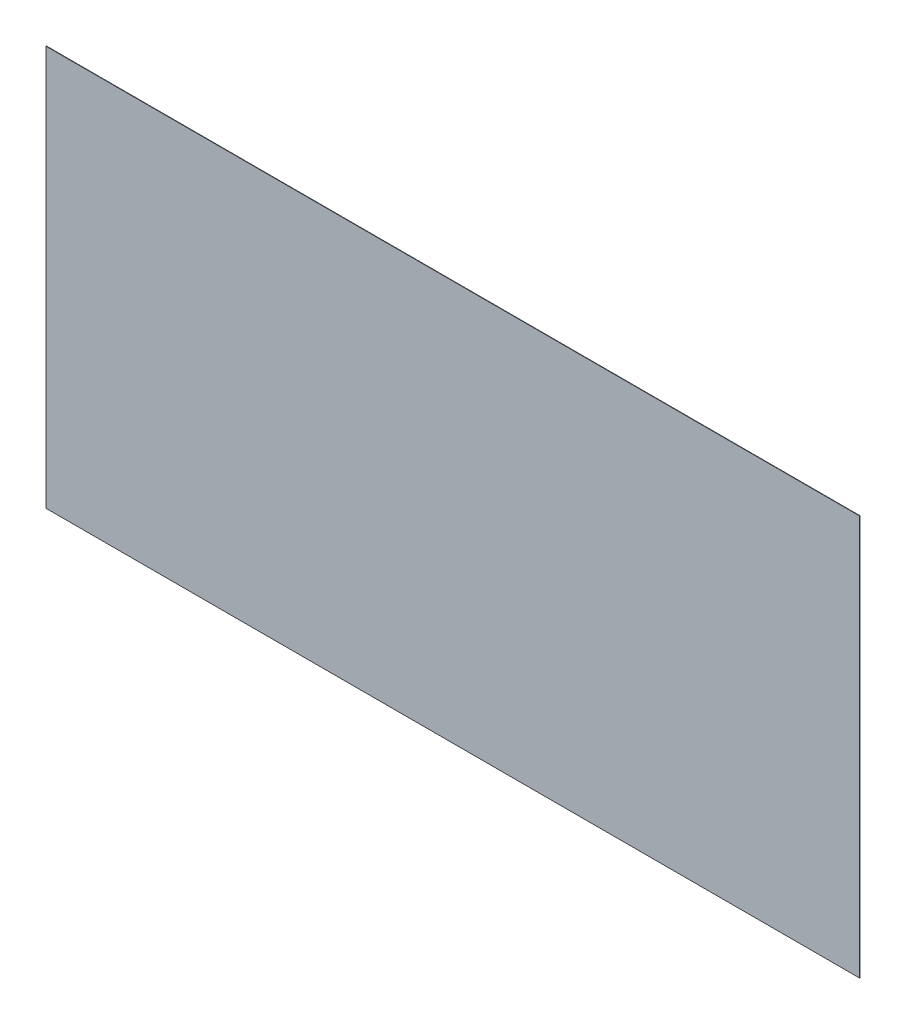
ISO-10303-21;
HEADER;
FILE_DESCRIPTION(('STEP AP214'),'2;1');
FILE_NAME('part.step','',(''),(''),'','','');
FILE_SCHEMA(('AUTOMOTIVE_DESIGN { 1 0 10303 214 1 1 1 1 }'));
ENDSEC;
DATA;
#1=APPLICATION_CONTEXT('core data for automotive mechanical design processes');
#2=APPLICATION_PROTOCOL_DEFINITION('international standard','automotive_design',2000,#1);
#3=PRODUCT_CONTEXT('',#1,'mechanical');
#4=PRODUCT('Part','Part','',(#3));
#5=PRODUCT_RELATED_PRODUCT_CATEGORY('part','',(#4));
#6=PRODUCT_DEFINITION_FORMATION('','',#4);
#7=PRODUCT_DEFINITION_CONTEXT('part definition',#1,'design');
#8=PRODUCT_DEFINITION('design','',#6,#7);
#9=PRODUCT_DEFINITION_SHAPE('','',#8);
#10=(LENGTH_UNIT() NAMED_UNIT(*) SI_UNIT(.MILLI.,.METRE.));
#11=(NAMED_UNIT(*) PLANE_ANGLE_UNIT() SI_UNIT($,.RADIAN.));
#12=(NAMED_UNIT(*) SI_UNIT($,.STERADIAN.) SOLID_ANGLE_UNIT());
#13=UNCERTAINTY_MEASURE_WITH_UNIT(LENGTH_MEASURE(1.E-05),#10,'distance_accuracy_value','');
#14=(GEOMETRIC_REPRESENTATION_CONTEXT(3) GLOBAL_UNCERTAINTY_ASSIGNED_CONTEXT((#13)) GLOBAL_UNIT_ASSIGNED_CONTEXT((#10,
#11,#12)) REPRESENTATION_CONTEXT('',''));
#15=CARTESIAN_POINT('',(0.,0.,0.));
#16=DIRECTION('',(0.,0.,1.));
#17=DIRECTION('',(1.,0.,0.));
#18=AXIS2_PLACEMENT_3D('',#15,#16,#17);
#19=CARTESIAN_POINT('',(-400000.,-60.0000000000023,151.327));
#20=DIRECTION('',(0.,-1.,0.));
#21=DIRECTION('',(0.,0.,-1.));
#22=AXIS2_PLACEMENT_3D('',#19,#20,#21);
#23=PLANE('',#22);
#24=DIRECTION('',(-1.,0.,0.));
#25=VECTOR('',#24,1.);
#26=CARTESIAN_POINT('',(-400000.,-60.0000000000023,151.2));
#27=LINE('',#26,#25);
#28=CARTESIAN_POINT('',(125.000000000024,-60.0000000000023,151.2));
#29=VERTEX_POINT('',#28);
#30=CARTESIAN_POINT('',(-125.000000000009,-60.0000000000023,151.2));
#31=VERTEX_POINT('',#30);
#32=EDGE_CURVE('E117',#29,#31,#27,.T.);
#33=ORIENTED_EDGE('',*,*,#32,.F.);
#34=DIRECTION('',(0.,0.,-1.));
#35=VECTOR('',#34,1.);
#36=CARTESIAN_POINT('',(125.000000000024,-60.0000000000023,151.327));
#37=LINE('',#36,#35);
#38=CARTESIAN_POINT('',(125.000000000024,-60.0000000000023,151.327));
#39=VERTEX_POINT('',#38);
#40=EDGE_CURVE('E11',#39,#29,#37,.T.);
#41=ORIENTED_EDGE('',*,*,#40,.F.);
#42=DIRECTION('',(-1.,0.,0.));
#43=VECTOR('',#42,1.);
#44=CARTESIAN_POINT('',(-400000.,-60.0000000000023,151.327));
#45=LINE('',#44,#43);
#46=CARTESIAN_POINT('',(-125.000000000009,-60.0000000000023,151.327));
#47=VERTEX_POINT('',#46);
#48=EDGE_CURVE('E109',#39,#47,#45,.T.);
#49=ORIENTED_EDGE('',*,*,#48,.T.);
#50=DIRECTION('',(0.,0.,-1.));
#51=VECTOR('',#50,1.);
#52=CARTESIAN_POINT('',(-125.000000000009,-60.0000000000023,151.327));
#53=LINE('',#52,#51);
#54=EDGE_CURVE('E50',#47,#31,#53,.T.);
#55=ORIENTED_EDGE('',*,*,#54,.T.);
#56=EDGE_LOOP('',(#33,#41,#49,#55));
#57=FACE_BOUND('',#56,.T.);
#58=ADVANCED_FACE('F47',(#57),#23,.T.);
#59=CARTESIAN_POINT('',(125.000000000057,-291534.,151.327));
#60=DIRECTION('',(1.,0.,0.));
#61=DIRECTION('',(0.,1.,0.));
#62=AXIS2_PLACEMENT_3D('',#59,#60,#61);
#63=PLANE('',#62);
#64=DIRECTION('',(0.,-1.,0.));
#65=VECTOR('',#64,1.);
#66=CARTESIAN_POINT('',(125.000000000057,-291534.,151.2));
#67=LINE('',#66,#65);
#68=CARTESIAN_POINT('',(125.000000000024,62.9999999999882,151.2));
#69=VERTEX_POINT('',#68);
#70=EDGE_CURVE('E112',#69,#29,#67,.T.);
#71=ORIENTED_EDGE('',*,*,#70,.F.);
#72=DIRECTION('',(0.,0.,-1.));
#73=VECTOR('',#72,1.);
#74=CARTESIAN_POINT('',(125.000000000024,62.9999999999882,151.327));
#75=LINE('',#74,#73);
#76=CARTESIAN_POINT('',(125.000000000024,62.9999999999882,151.327));
#77=VERTEX_POINT('',#76);
#78=EDGE_CURVE('E57',#77,#69,#75,.T.);
#79=ORIENTED_EDGE('',*,*,#78,.F.);
#80=DIRECTION('',(0.,-1.,0.));
#81=VECTOR('',#80,1.);
#82=CARTESIAN_POINT('',(125.000000000057,-291534.,151.327));
#83=LINE('',#82,#81);
#84=EDGE_CURVE('E104',#77,#39,#83,.T.);
#85=ORIENTED_EDGE('',*,*,#84,.T.);
#86=ORIENTED_EDGE('',*,*,#40,.T.);
#87=EDGE_LOOP('',(#71,#79,#85,#86));
#88=FACE_BOUND('',#87,.T.);
#89=ADVANCED_FACE('F133',(#88),#63,.T.);
#90=CARTESIAN_POINT('',(-400000.,62.9999999999882,151.327));
#91=DIRECTION('',(0.,1.,0.));
#92=DIRECTION('',(0.,0.,1.));
#93=AXIS2_PLACEMENT_3D('',#90,#91,#92);
#94=PLANE('',#93);
#95=DIRECTION('',(1.,0.,0.));
#96=VECTOR('',#95,1.);
#97=CARTESIAN_POINT('',(-400000.,62.9999999999882,151.2));
#98=LINE('',#97,#96);
#99=CARTESIAN_POINT('',(-125.,62.9999999999882,151.2));
#100=VERTEX_POINT('',#99);
#101=EDGE_CURVE('E98',#100,#69,#98,.T.);
#102=ORIENTED_EDGE('',*,*,#101,.F.);
#103=DIRECTION('',(0.,0.,-1.));
#104=VECTOR('',#103,1.);
#105=CARTESIAN_POINT('',(-125.,62.9999999999882,151.327));
#106=LINE('',#105,#104);
#107=CARTESIAN_POINT('',(-125.,62.9999999999882,151.327));
#108=VERTEX_POINT('',#107);
#109=EDGE_CURVE('E93',#108,#100,#106,.T.);
#110=ORIENTED_EDGE('',*,*,#109,.F.);
#111=DIRECTION('',(1.,0.,0.));
#112=VECTOR('',#111,1.);
#113=CARTESIAN_POINT('',(-400000.,62.9999999999882,151.327));
#114=LINE('',#113,#112);
#115=EDGE_CURVE('E96',#108,#77,#114,.T.);
#116=ORIENTED_EDGE('',*,*,#115,.T.);
#117=ORIENTED_EDGE('',*,*,#78,.T.);
#118=EDGE_LOOP('',(#102,#110,#116,#117));
#119=FACE_BOUND('',#118,.T.);
#120=ADVANCED_FACE('F95',(#119),#94,.T.);
#121=CARTESIAN_POINT('',(-124.999999999943,-291534.,151.327));
#122=DIRECTION('',(-1.,0.,0.));
#123=DIRECTION('',(0.,-1.,0.));
#124=AXIS2_PLACEMENT_3D('',#121,#122,#123);
#125=PLANE('',#124);
#126=DIRECTION('',(0.,1.,0.));
#127=VECTOR('',#126,1.);
#128=CARTESIAN_POINT('',(-124.999999999943,-291534.,151.2));
#129=LINE('',#128,#127);
#130=EDGE_CURVE('E121',#31,#100,#129,.T.);
#131=ORIENTED_EDGE('',*,*,#130,.F.);
#132=ORIENTED_EDGE('',*,*,#54,.F.);
#133=DIRECTION('',(0.,1.,0.));
#134=VECTOR('',#133,1.);
#135=CARTESIAN_POINT('',(-124.999999999943,-291534.,151.327));
#136=LINE('',#135,#134);
#137=EDGE_CURVE('E103',#47,#108,#136,.T.);
#138=ORIENTED_EDGE('',*,*,#137,.T.);
#139=ORIENTED_EDGE('',*,*,#109,.T.);
#140=EDGE_LOOP('',(#131,#132,#138,#139));
#141=FACE_BOUND('',#140,.T.);
#142=ADVANCED_FACE('F107',(#141),#125,.T.);
#143=CARTESIAN_POINT('',(0.,0.,151.327));
#144=DIRECTION('',(0.,0.,-1.));
#145=DIRECTION('',(-1.,0.,0.));
#146=AXIS2_PLACEMENT_3D('',#143,#144,#145);
#147=PLANE('',#146);
#148=ORIENTED_EDGE('',*,*,#48,.F.);
#149=ORIENTED_EDGE('',*,*,#84,.F.);
#150=ORIENTED_EDGE('',*,*,#115,.F.);
#151=ORIENTED_EDGE('',*,*,#137,.F.);
#152=EDGE_LOOP('',(#148,#149,#150,#151));
#153=FACE_BOUND('',#152,.T.);
#154=ADVANCED_FACE('F102',(#153),#147,.F.);
#155=CARTESIAN_POINT('',(0.,0.,151.2));
#156=DIRECTION('',(0.,0.,-1.));
#157=DIRECTION('',(-1.,0.,0.));
#158=AXIS2_PLACEMENT_3D('',#155,#156,#157);
#159=PLANE('',#158);
#160=ORIENTED_EDGE('',*,*,#32,.T.);
#161=ORIENTED_EDGE('',*,*,#130,.T.);
#162=ORIENTED_EDGE('',*,*,#101,.T.);
#163=ORIENTED_EDGE('',*,*,#70,.T.);
#164=EDGE_LOOP('',(#160,#161,#162,#163));
#165=FACE_BOUND('',#164,.T.);
#166=ADVANCED_FACE('F132',(#165),#159,.T.);
#167=CLOSED_SHELL('',(#58,#89,#120,#142,#154,#166));
#168=MANIFOLD_SOLID_BREP('B2',#167);
#169=ADVANCED_BREP_SHAPE_REPRESENTATION('',(#18,#168),#14);
#170=SHAPE_DEFINITION_REPRESENTATION(#9,#169);
ENDSEC;
END-ISO-10303-21;
